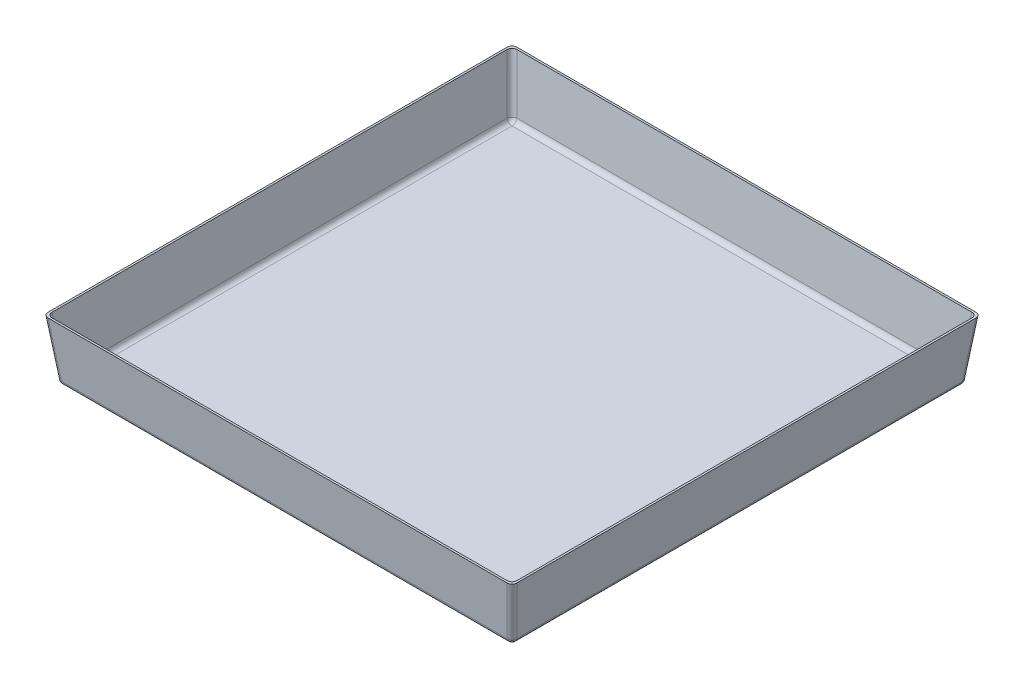
ISO-10303-21;
HEADER;
FILE_DESCRIPTION(('STEP AP214'),'2;1');
FILE_NAME('part.step','',(''),(''),'','','');
FILE_SCHEMA(('AUTOMOTIVE_DESIGN { 1 0 10303 214 1 1 1 1 }'));
ENDSEC;
DATA;
#1=APPLICATION_CONTEXT('core data for automotive mechanical design processes');
#2=APPLICATION_PROTOCOL_DEFINITION('international standard','automotive_design',2000,#1);
#3=PRODUCT_CONTEXT('',#1,'mechanical');
#4=PRODUCT('Part','Part','',(#3));
#5=PRODUCT_RELATED_PRODUCT_CATEGORY('part','',(#4));
#6=PRODUCT_DEFINITION_FORMATION('','',#4);
#7=PRODUCT_DEFINITION_CONTEXT('part definition',#1,'design');
#8=PRODUCT_DEFINITION('design','',#6,#7);
#9=PRODUCT_DEFINITION_SHAPE('','',#8);
#10=(LENGTH_UNIT() NAMED_UNIT(*) SI_UNIT(.MILLI.,.METRE.));
#11=(NAMED_UNIT(*) PLANE_ANGLE_UNIT() SI_UNIT($,.RADIAN.));
#12=(NAMED_UNIT(*) SI_UNIT($,.STERADIAN.) SOLID_ANGLE_UNIT());
#13=UNCERTAINTY_MEASURE_WITH_UNIT(LENGTH_MEASURE(1.E-05),#10,'distance_accuracy_value','');
#14=(GEOMETRIC_REPRESENTATION_CONTEXT(3) GLOBAL_UNCERTAINTY_ASSIGNED_CONTEXT((#13)) GLOBAL_UNIT_ASSIGNED_CONTEXT((#10,
#11,#12)) REPRESENTATION_CONTEXT('',''));
#15=CARTESIAN_POINT('',(0.,0.,0.));
#16=DIRECTION('',(0.,0.,1.));
#17=DIRECTION('',(1.,0.,0.));
#18=AXIS2_PLACEMENT_3D('',#15,#16,#17);
#19=CARTESIAN_POINT('',(-460.,0.,460.));
#20=DIRECTION('',(-0.992546151641322,-0.121869343405148,0.));
#21=DIRECTION('',(0.121869343405148,-0.992546151641322,0.));
#22=AXIS2_PLACEMENT_3D('',#19,#20,#21);
#23=PLANE('',#22);
#24=DIRECTION('',(-0.120974291151355,0.985256536015293,-0.120974291151355));
#25=VECTOR('',#24,1.);
#26=CARTESIAN_POINT('',(-446.681260146946,-108.472431347346,-436.755798630532));
#27=LINE('',#26,#25);
#28=CARTESIAN_POINT('',(-474.734147308349,120.,-464.808685791935));
#29=VERTEX_POINT('',#28);
#30=CARTESIAN_POINT('',(-461.078208870854,8.78130656594857,-451.152747354441));
#31=VERTEX_POINT('',#30);
#32=EDGE_CURVE('E331',#29,#31,#27,.F.);
#33=ORIENTED_EDGE('',*,*,#32,.T.);
#34=DIRECTION('',(0.,0.,1.));
#35=VECTOR('',#34,1.);
#36=CARTESIAN_POINT('',(-461.078208870854,8.78130656594853,460.));
#37=LINE('',#36,#35);
#38=CARTESIAN_POINT('',(-461.078208870854,8.78130656594853,451.152747354441));
#39=VERTEX_POINT('',#38);
#40=EDGE_CURVE('E240',#31,#39,#37,.T.);
#41=ORIENTED_EDGE('',*,*,#40,.T.);
#42=DIRECTION('',(-0.120974291151355,0.985256536015293,0.120974291151355));
#43=VECTOR('',#42,1.);
#44=CARTESIAN_POINT('',(-460.145256936953,1.18302281560784,450.219795420539));
#45=LINE('',#44,#43);
#46=CARTESIAN_POINT('',(-474.734147308349,120.,464.808685791935));
#47=VERTEX_POINT('',#46);
#48=EDGE_CURVE('E326',#39,#47,#45,.T.);
#49=ORIENTED_EDGE('',*,*,#48,.T.);
#50=DIRECTION('',(0.,0.,-1.));
#51=VECTOR('',#50,1.);
#52=CARTESIAN_POINT('',(-474.734147308349,120.,460.));
#53=LINE('',#52,#51);
#54=EDGE_CURVE('E200',#29,#47,#53,.F.);
#55=ORIENTED_EDGE('',*,*,#54,.F.);
#56=EDGE_LOOP('',(#33,#41,#49,#55));
#57=FACE_BOUND('',#56,.T.);
#58=ADVANCED_FACE('F40',(#57),#23,.T.);
#59=CARTESIAN_POINT('',(460.,0.,460.));
#60=DIRECTION('',(0.,-0.121869343405148,0.992546151641322));
#61=DIRECTION('',(0.,-0.992546151641322,-0.121869343405148));
#62=AXIS2_PLACEMENT_3D('',#59,#60,#61);
#63=PLANE('',#62);
#64=DIRECTION('',(-0.120974291151355,0.985256536015293,0.120974291151355));
#65=VECTOR('',#64,1.);
#66=CARTESIAN_POINT('',(-436.755798630533,-108.472431347346,446.681260146946));
#67=LINE('',#66,#65);
#68=CARTESIAN_POINT('',(-464.808685791935,120.,474.734147308349));
#69=VERTEX_POINT('',#68);
#70=CARTESIAN_POINT('',(-451.152747354441,8.78130656594855,461.078208870854));
#71=VERTEX_POINT('',#70);
#72=EDGE_CURVE('E359',#69,#71,#67,.F.);
#73=ORIENTED_EDGE('',*,*,#72,.T.);
#74=DIRECTION('',(1.,0.,0.));
#75=VECTOR('',#74,1.);
#76=CARTESIAN_POINT('',(460.,8.78130656594853,461.078208870854));
#77=LINE('',#76,#75);
#78=CARTESIAN_POINT('',(451.152747354441,8.78130656594852,461.078208870854));
#79=VERTEX_POINT('',#78);
#80=EDGE_CURVE('E219',#71,#79,#77,.T.);
#81=ORIENTED_EDGE('',*,*,#80,.T.);
#82=DIRECTION('',(0.120974291151355,0.985256536015293,0.120974291151355));
#83=VECTOR('',#82,1.);
#84=CARTESIAN_POINT('',(450.219795420539,1.18302281560784,460.145256936953));
#85=LINE('',#84,#83);
#86=CARTESIAN_POINT('',(464.808685791935,120.,474.734147308349));
#87=VERTEX_POINT('',#86);
#88=EDGE_CURVE('E211',#79,#87,#85,.T.);
#89=ORIENTED_EDGE('',*,*,#88,.T.);
#90=DIRECTION('',(-1.,0.,0.));
#91=VECTOR('',#90,1.);
#92=CARTESIAN_POINT('',(460.,120.,474.734147308349));
#93=LINE('',#92,#91);
#94=EDGE_CURVE('E366',#69,#87,#93,.F.);
#95=ORIENTED_EDGE('',*,*,#94,.F.);
#96=EDGE_LOOP('',(#73,#81,#89,#95));
#97=FACE_BOUND('',#96,.T.);
#98=ADVANCED_FACE('F365',(#97),#63,.T.);
#99=CARTESIAN_POINT('',(460.,0.,460.));
#100=DIRECTION('',(0.992546151641322,-0.121869343405148,0.));
#101=DIRECTION('',(0.121869343405148,0.992546151641322,0.));
#102=AXIS2_PLACEMENT_3D('',#99,#100,#101);
#103=PLANE('',#102);
#104=DIRECTION('',(0.120974291151355,0.985256536015293,0.120974291151355));
#105=VECTOR('',#104,1.);
#106=CARTESIAN_POINT('',(460.145256936953,1.18302281560784,450.219795420539));
#107=LINE('',#106,#105);
#108=CARTESIAN_POINT('',(474.734147308349,120.,464.808685791935));
#109=VERTEX_POINT('',#108);
#110=CARTESIAN_POINT('',(461.078208870854,8.78130656594853,451.152747354441));
#111=VERTEX_POINT('',#110);
#112=EDGE_CURVE('E350',#109,#111,#107,.F.);
#113=ORIENTED_EDGE('',*,*,#112,.T.);
#114=DIRECTION('',(0.,0.,-1.));
#115=VECTOR('',#114,1.);
#116=CARTESIAN_POINT('',(461.078208870854,8.78130656594853,460.));
#117=LINE('',#116,#115);
#118=CARTESIAN_POINT('',(461.078208870854,8.78130656594855,-451.152747354441));
#119=VERTEX_POINT('',#118);
#120=EDGE_CURVE('E232',#111,#119,#117,.T.);
#121=ORIENTED_EDGE('',*,*,#120,.T.);
#122=DIRECTION('',(0.120974291151355,0.985256536015293,-0.120974291151355));
#123=VECTOR('',#122,1.);
#124=CARTESIAN_POINT('',(446.681260146946,-108.472431347346,-436.755798630533));
#125=LINE('',#124,#123);
#126=CARTESIAN_POINT('',(474.734147308349,120.,-464.808685791935));
#127=VERTEX_POINT('',#126);
#128=EDGE_CURVE('E353',#119,#127,#125,.T.);
#129=ORIENTED_EDGE('',*,*,#128,.T.);
#130=DIRECTION('',(0.,0.,1.));
#131=VECTOR('',#130,1.);
#132=CARTESIAN_POINT('',(474.734147308349,120.,460.));
#133=LINE('',#132,#131);
#134=EDGE_CURVE('E377',#109,#127,#133,.F.);
#135=ORIENTED_EDGE('',*,*,#134,.F.);
#136=EDGE_LOOP('',(#113,#121,#129,#135));
#137=FACE_BOUND('',#136,.T.);
#138=ADVANCED_FACE('F383',(#137),#103,.T.);
#139=CARTESIAN_POINT('',(460.,0.,-460.));
#140=DIRECTION('',(0.,-0.121869343405148,-0.992546151641322));
#141=DIRECTION('',(0.,0.992546151641322,-0.121869343405148));
#142=AXIS2_PLACEMENT_3D('',#139,#140,#141);
#143=PLANE('',#142);
#144=DIRECTION('',(0.120974291151355,0.985256536015293,-0.120974291151355));
#145=VECTOR('',#144,1.);
#146=CARTESIAN_POINT('',(450.219795420539,1.18302281560784,-460.145256936953));
#147=LINE('',#146,#145);
#148=CARTESIAN_POINT('',(464.808685791935,120.,-474.734147308349));
#149=VERTEX_POINT('',#148);
#150=CARTESIAN_POINT('',(451.152747354441,8.78130656594853,-461.078208870854));
#151=VERTEX_POINT('',#150);
#152=EDGE_CURVE('E334',#149,#151,#147,.F.);
#153=ORIENTED_EDGE('',*,*,#152,.T.);
#154=DIRECTION('',(-1.,0.,0.));
#155=VECTOR('',#154,1.);
#156=CARTESIAN_POINT('',(460.,8.78130656594853,-461.078208870854));
#157=LINE('',#156,#155);
#158=CARTESIAN_POINT('',(-451.152747354441,8.78130656594854,-461.078208870854));
#159=VERTEX_POINT('',#158);
#160=EDGE_CURVE('E236',#151,#159,#157,.T.);
#161=ORIENTED_EDGE('',*,*,#160,.T.);
#162=DIRECTION('',(-0.120974291151355,0.985256536015293,-0.120974291151355));
#163=VECTOR('',#162,1.);
#164=CARTESIAN_POINT('',(-436.755798630533,-108.472431347346,-446.681260146945));
#165=LINE('',#164,#163);
#166=CARTESIAN_POINT('',(-464.808685791935,120.,-474.734147308348));
#167=VERTEX_POINT('',#166);
#168=EDGE_CURVE('E337',#159,#167,#165,.T.);
#169=ORIENTED_EDGE('',*,*,#168,.T.);
#170=DIRECTION('',(1.,0.,0.));
#171=VECTOR('',#170,1.);
#172=CARTESIAN_POINT('',(460.,120.,-474.734147308349));
#173=LINE('',#172,#171);
#174=EDGE_CURVE('E189',#149,#167,#173,.F.);
#175=ORIENTED_EDGE('',*,*,#174,.F.);
#176=EDGE_LOOP('',(#153,#161,#169,#175));
#177=FACE_BOUND('',#176,.T.);
#178=ADVANCED_FACE('F415',(#177),#143,.T.);
#179=CARTESIAN_POINT('',(-460.,120.,-460.));
#180=DIRECTION('',(0.,1.,0.));
#181=DIRECTION('',(0.,0.,1.));
#182=AXIS2_PLACEMENT_3D('',#179,#180,#181);
#183=PLANE('',#182);
#184=DIRECTION('',(0.,0.,-1.));
#185=VECTOR('',#184,1.);
#186=CARTESIAN_POINT('',(-470.704108006513,120.,460.));
#187=LINE('',#186,#185);
#188=CARTESIAN_POINT('',(-470.704108006513,120.,-460.7786464901));
#189=VERTEX_POINT('',#188);
#190=CARTESIAN_POINT('',(-470.704108006513,120.,460.7786464901));
#191=VERTEX_POINT('',#190);
#192=EDGE_CURVE('E285',#189,#191,#187,.F.);
#193=ORIENTED_EDGE('',*,*,#192,.F.);
#194=CARTESIAN_POINT('',(-460.629009751925,120.,-460.629009751925));
#195=DIRECTION('',(0.,1.,0.));
#196=DIRECTION('',(-0.707106781186548,0.,-0.707106781186548));
#197=AXIS2_PLACEMENT_3D('',#194,#195,#196);
#198=ELLIPSE('',#197,10.1496408645441,10.);
#199=CARTESIAN_POINT('',(-460.7786464901,120.,-470.704108006513));
#200=VERTEX_POINT('',#199);
#201=EDGE_CURVE('E199',#189,#200,#198,.F.);
#202=ORIENTED_EDGE('',*,*,#201,.T.);
#203=DIRECTION('',(1.,0.,0.));
#204=VECTOR('',#203,1.);
#205=CARTESIAN_POINT('',(460.,120.,-470.704108006513));
#206=LINE('',#205,#204);
#207=CARTESIAN_POINT('',(460.7786464901,120.,-470.704108006513));
#208=VERTEX_POINT('',#207);
#209=EDGE_CURVE('E182',#208,#200,#206,.F.);
#210=ORIENTED_EDGE('',*,*,#209,.F.);
#211=CARTESIAN_POINT('',(460.629009751925,120.,-460.629009751925));
#212=DIRECTION('',(0.,1.,0.));
#213=DIRECTION('',(0.707106781186547,0.,-0.707106781186548));
#214=AXIS2_PLACEMENT_3D('',#211,#212,#213);
#215=ELLIPSE('',#214,10.1496408645441,10.);
#216=CARTESIAN_POINT('',(470.704108006513,120.,-460.7786464901));
#217=VERTEX_POINT('',#216);
#218=EDGE_CURVE('E196',#208,#217,#215,.F.);
#219=ORIENTED_EDGE('',*,*,#218,.T.);
#220=DIRECTION('',(0.,0.,1.));
#221=VECTOR('',#220,1.);
#222=CARTESIAN_POINT('',(470.704108006513,120.,460.));
#223=LINE('',#222,#221);
#224=CARTESIAN_POINT('',(470.704108006513,120.,460.7786464901));
#225=VERTEX_POINT('',#224);
#226=EDGE_CURVE('E201',#225,#217,#223,.F.);
#227=ORIENTED_EDGE('',*,*,#226,.F.);
#228=CARTESIAN_POINT('',(460.629009751925,120.,460.629009751925));
#229=DIRECTION('',(0.,1.,0.));
#230=DIRECTION('',(0.707106781186548,0.,0.707106781186548));
#231=AXIS2_PLACEMENT_3D('',#228,#229,#230);
#232=ELLIPSE('',#231,10.1496408645441,10.);
#233=CARTESIAN_POINT('',(460.7786464901,120.,470.704108006513));
#234=VERTEX_POINT('',#233);
#235=EDGE_CURVE('E207',#225,#234,#232,.F.);
#236=ORIENTED_EDGE('',*,*,#235,.T.);
#237=DIRECTION('',(-1.,0.,0.));
#238=VECTOR('',#237,1.);
#239=CARTESIAN_POINT('',(460.,120.,470.704108006513));
#240=LINE('',#239,#238);
#241=CARTESIAN_POINT('',(-460.7786464901,120.,470.704108006513));
#242=VERTEX_POINT('',#241);
#243=EDGE_CURVE('E423',#242,#234,#240,.F.);
#244=ORIENTED_EDGE('',*,*,#243,.F.);
#245=CARTESIAN_POINT('',(-460.629009751925,120.,460.629009751925));
#246=DIRECTION('',(0.,1.,0.));
#247=DIRECTION('',(-0.707106781186547,0.,0.707106781186548));
#248=AXIS2_PLACEMENT_3D('',#245,#246,#247);
#249=ELLIPSE('',#248,10.1496408645441,10.);
#250=EDGE_CURVE('E209',#242,#191,#249,.F.);
#251=ORIENTED_EDGE('',*,*,#250,.T.);
#252=EDGE_LOOP('',(#193,#202,#210,#219,#227,#236,#244,#251));
#253=FACE_BOUND('',#252,.T.);
#254=ORIENTED_EDGE('',*,*,#174,.T.);
#255=CARTESIAN_POINT('',(-464.65904905376,120.,-464.65904905376));
#256=DIRECTION('',(0.,1.,0.));
#257=DIRECTION('',(0.707106781186548,0.,0.707106781186548));
#258=AXIS2_PLACEMENT_3D('',#255,#256,#257);
#259=ELLIPSE('',#258,10.1496408645441,10.);
#260=EDGE_CURVE('E345',#167,#29,#259,.T.);
#261=ORIENTED_EDGE('',*,*,#260,.T.);
#262=ORIENTED_EDGE('',*,*,#54,.T.);
#263=CARTESIAN_POINT('',(-464.65904905376,120.,464.65904905376));
#264=DIRECTION('',(0.,1.,0.));
#265=DIRECTION('',(0.707106781186547,0.,-0.707106781186548));
#266=AXIS2_PLACEMENT_3D('',#263,#264,#265);
#267=ELLIPSE('',#266,10.1496408645441,10.);
#268=EDGE_CURVE('E339',#47,#69,#267,.T.);
#269=ORIENTED_EDGE('',*,*,#268,.T.);
#270=ORIENTED_EDGE('',*,*,#94,.T.);
#271=CARTESIAN_POINT('',(464.65904905376,120.,464.65904905376));
#272=DIRECTION('',(0.,1.,0.));
#273=DIRECTION('',(-0.707106781186548,0.,-0.707106781186548));
#274=AXIS2_PLACEMENT_3D('',#271,#272,#273);
#275=ELLIPSE('',#274,10.1496408645441,10.);
#276=EDGE_CURVE('E341',#87,#109,#275,.T.);
#277=ORIENTED_EDGE('',*,*,#276,.T.);
#278=ORIENTED_EDGE('',*,*,#134,.T.);
#279=CARTESIAN_POINT('',(464.65904905376,120.,-464.65904905376));
#280=DIRECTION('',(0.,1.,0.));
#281=DIRECTION('',(-0.707106781186547,0.,0.707106781186548));
#282=AXIS2_PLACEMENT_3D('',#279,#280,#281);
#283=ELLIPSE('',#282,10.1496408645441,10.);
#284=EDGE_CURVE('E343',#127,#149,#283,.T.);
#285=ORIENTED_EDGE('',*,*,#284,.T.);
#286=EDGE_LOOP('',(#254,#261,#262,#269,#270,#277,#278,#285));
#287=FACE_BOUND('',#286,.T.);
#288=ADVANCED_FACE('F193',(#253,#287),#183,.T.);
#289=CARTESIAN_POINT('',(-460.,0.,-460.));
#290=DIRECTION('',(0.,1.,0.));
#291=DIRECTION('',(0.,0.,1.));
#292=AXIS2_PLACEMENT_3D('',#289,#290,#291);
#293=PLANE('',#292);
#294=DIRECTION('',(0.,0.,1.));
#295=VECTOR('',#294,1.);
#296=CARTESIAN_POINT('',(451.152747354441,0.,-460.));
#297=LINE('',#296,#295);
#298=CARTESIAN_POINT('',(451.152747354441,0.,-451.152747354441));
#299=VERTEX_POINT('',#298);
#300=CARTESIAN_POINT('',(451.152747354441,0.,451.152747354441));
#301=VERTEX_POINT('',#300);
#302=EDGE_CURVE('E225',#299,#301,#297,.T.);
#303=ORIENTED_EDGE('',*,*,#302,.T.);
#304=DIRECTION('',(-1.,0.,0.));
#305=VECTOR('',#304,1.);
#306=CARTESIAN_POINT('',(-460.,0.,451.152747354441));
#307=LINE('',#306,#305);
#308=CARTESIAN_POINT('',(-451.152747354441,0.,451.152747354441));
#309=VERTEX_POINT('',#308);
#310=EDGE_CURVE('E227',#301,#309,#307,.T.);
#311=ORIENTED_EDGE('',*,*,#310,.T.);
#312=DIRECTION('',(0.,0.,-1.));
#313=VECTOR('',#312,1.);
#314=CARTESIAN_POINT('',(-451.152747354441,0.,-460.));
#315=LINE('',#314,#313);
#316=CARTESIAN_POINT('',(-451.152747354441,0.,-451.152747354441));
#317=VERTEX_POINT('',#316);
#318=EDGE_CURVE('E221',#309,#317,#315,.T.);
#319=ORIENTED_EDGE('',*,*,#318,.T.);
#320=DIRECTION('',(1.,0.,0.));
#321=VECTOR('',#320,1.);
#322=CARTESIAN_POINT('',(-460.,0.,-451.152747354441));
#323=LINE('',#322,#321);
#324=EDGE_CURVE('E223',#317,#299,#323,.T.);
#325=ORIENTED_EDGE('',*,*,#324,.T.);
#326=EDGE_LOOP('',(#303,#311,#319,#325));
#327=FACE_BOUND('',#326,.T.);
#328=ADVANCED_FACE('F399',(#327),#293,.F.);
#329=CARTESIAN_POINT('',(-456.029815393435,0.487477373620591,460.));
#330=DIRECTION('',(-0.992546151641322,-0.121869343405148,0.));
#331=DIRECTION('',(0.121869343405148,-0.992546151641322,0.));
#332=AXIS2_PLACEMENT_3D('',#329,#330,#331);
#333=PLANE('',#332);
#334=DIRECTION('',(-0.120974291151355,0.985256536015293,0.120974291151355));
#335=VECTOR('',#334,1.);
#336=CARTESIAN_POINT('',(-456.606355878729,5.18302281560784,446.680894362316));
#337=LINE('',#336,#335);
#338=CARTESIAN_POINT('',(-457.53930781263,12.7813065659485,447.613846296217));
#339=VERTEX_POINT('',#338);
#340=EDGE_CURVE('E320',#191,#339,#337,.F.);
#341=ORIENTED_EDGE('',*,*,#340,.T.);
#342=DIRECTION('',(0.,0.,1.));
#343=VECTOR('',#342,1.);
#344=CARTESIAN_POINT('',(-457.53930781263,12.7813065659485,-446.535637425363));
#345=LINE('',#344,#343);
#346=CARTESIAN_POINT('',(-457.53930781263,12.7813065659485,-447.613846296217));
#347=VERTEX_POINT('',#346);
#348=EDGE_CURVE('E64',#339,#347,#345,.F.);
#349=ORIENTED_EDGE('',*,*,#348,.T.);
#350=DIRECTION('',(-0.120974291151355,0.985256536015293,-0.120974291151355));
#351=VECTOR('',#350,1.);
#352=CARTESIAN_POINT('',(-470.849364943466,121.183022815608,-460.923903427052));
#353=LINE('',#352,#351);
#354=EDGE_CURVE('E324',#347,#189,#353,.T.);
#355=ORIENTED_EDGE('',*,*,#354,.T.);
#356=ORIENTED_EDGE('',*,*,#192,.T.);
#357=EDGE_LOOP('',(#341,#349,#355,#356));
#358=FACE_BOUND('',#357,.T.);
#359=ADVANCED_FACE('F323',(#358),#333,.F.);
#360=CARTESIAN_POINT('',(460.,0.487477373620591,456.029815393435));
#361=DIRECTION('',(0.,-0.121869343405148,0.992546151641322));
#362=DIRECTION('',(0.,-0.992546151641322,-0.121869343405148));
#363=AXIS2_PLACEMENT_3D('',#360,#361,#362);
#364=PLANE('',#363);
#365=DIRECTION('',(0.120974291151355,0.985256536015293,0.120974291151355));
#366=VECTOR('',#365,1.);
#367=CARTESIAN_POINT('',(446.680894362316,5.18302281560784,456.606355878729));
#368=LINE('',#367,#366);
#369=CARTESIAN_POINT('',(447.613846296217,12.7813065659485,457.53930781263));
#370=VERTEX_POINT('',#369);
#371=EDGE_CURVE('E356',#234,#370,#368,.F.);
#372=ORIENTED_EDGE('',*,*,#371,.T.);
#373=DIRECTION('',(1.,0.,0.));
#374=VECTOR('',#373,1.);
#375=CARTESIAN_POINT('',(-446.535637425363,12.7813065659485,457.53930781263));
#376=LINE('',#375,#374);
#377=CARTESIAN_POINT('',(-447.613846296217,12.7813065659485,457.53930781263));
#378=VERTEX_POINT('',#377);
#379=EDGE_CURVE('E257',#370,#378,#376,.F.);
#380=ORIENTED_EDGE('',*,*,#379,.T.);
#381=DIRECTION('',(-0.120974291151355,0.985256536015293,0.120974291151355));
#382=VECTOR('',#381,1.);
#383=CARTESIAN_POINT('',(-460.923903427053,121.183022815608,470.849364943466));
#384=LINE('',#383,#382);
#385=EDGE_CURVE('E321',#378,#242,#384,.T.);
#386=ORIENTED_EDGE('',*,*,#385,.T.);
#387=ORIENTED_EDGE('',*,*,#243,.T.);
#388=EDGE_LOOP('',(#372,#380,#386,#387));
#389=FACE_BOUND('',#388,.T.);
#390=ADVANCED_FACE('F429',(#389),#364,.F.);
#391=CARTESIAN_POINT('',(456.029815393435,0.487477373620591,460.));
#392=DIRECTION('',(0.992546151641322,-0.121869343405148,0.));
#393=DIRECTION('',(0.121869343405148,0.992546151641322,0.));
#394=AXIS2_PLACEMENT_3D('',#391,#392,#393);
#395=PLANE('',#394);
#396=DIRECTION('',(0.120974291151355,0.985256536015293,-0.120974291151355));
#397=VECTOR('',#396,1.);
#398=CARTESIAN_POINT('',(456.606355878729,5.18302281560787,-446.680894362315));
#399=LINE('',#398,#397);
#400=CARTESIAN_POINT('',(457.53930781263,12.7813065659485,-447.613846296217));
#401=VERTEX_POINT('',#400);
#402=EDGE_CURVE('E206',#217,#401,#399,.F.);
#403=ORIENTED_EDGE('',*,*,#402,.T.);
#404=DIRECTION('',(0.,0.,-1.));
#405=VECTOR('',#404,1.);
#406=CARTESIAN_POINT('',(457.53930781263,12.7813065659485,446.535637425363));
#407=LINE('',#406,#405);
#408=CARTESIAN_POINT('',(457.53930781263,12.7813065659485,447.613846296217));
#409=VERTEX_POINT('',#408);
#410=EDGE_CURVE('E253',#401,#409,#407,.F.);
#411=ORIENTED_EDGE('',*,*,#410,.T.);
#412=DIRECTION('',(0.120974291151355,0.985256536015293,0.120974291151355));
#413=VECTOR('',#412,1.);
#414=CARTESIAN_POINT('',(470.849364943466,121.183022815608,460.923903427053));
#415=LINE('',#414,#413);
#416=EDGE_CURVE('E347',#409,#225,#415,.T.);
#417=ORIENTED_EDGE('',*,*,#416,.T.);
#418=ORIENTED_EDGE('',*,*,#226,.T.);
#419=EDGE_LOOP('',(#403,#411,#417,#418));
#420=FACE_BOUND('',#419,.T.);
#421=ADVANCED_FACE('F457',(#420),#395,.F.);
#422=CARTESIAN_POINT('',(460.,0.487477373620591,-456.029815393435));
#423=DIRECTION('',(0.,-0.121869343405148,-0.992546151641322));
#424=DIRECTION('',(0.,0.992546151641322,-0.121869343405148));
#425=AXIS2_PLACEMENT_3D('',#422,#423,#424);
#426=PLANE('',#425);
#427=DIRECTION('',(-0.120974291151355,0.985256536015293,-0.120974291151355));
#428=VECTOR('',#427,1.);
#429=CARTESIAN_POINT('',(-446.680894362315,5.18302281560787,-456.606355878729));
#430=LINE('',#429,#428);
#431=CARTESIAN_POINT('',(-447.613846296217,12.7813065659485,-457.53930781263));
#432=VERTEX_POINT('',#431);
#433=EDGE_CURVE('E188',#200,#432,#430,.F.);
#434=ORIENTED_EDGE('',*,*,#433,.T.);
#435=DIRECTION('',(-1.,0.,0.));
#436=VECTOR('',#435,1.);
#437=CARTESIAN_POINT('',(446.535637425363,12.7813065659485,-457.53930781263));
#438=LINE('',#437,#436);
#439=CARTESIAN_POINT('',(447.613846296217,12.7813065659485,-457.53930781263));
#440=VERTEX_POINT('',#439);
#441=EDGE_CURVE('E12',#432,#440,#438,.F.);
#442=ORIENTED_EDGE('',*,*,#441,.T.);
#443=DIRECTION('',(0.120974291151355,0.985256536015293,-0.120974291151355));
#444=VECTOR('',#443,1.);
#445=CARTESIAN_POINT('',(460.923903427053,121.183022815608,-470.849364943466));
#446=LINE('',#445,#444);
#447=EDGE_CURVE('E179',#440,#208,#446,.T.);
#448=ORIENTED_EDGE('',*,*,#447,.T.);
#449=ORIENTED_EDGE('',*,*,#209,.T.);
#450=EDGE_LOOP('',(#434,#442,#448,#449));
#451=FACE_BOUND('',#450,.T.);
#452=ADVANCED_FACE('F181',(#451),#426,.F.);
#453=CARTESIAN_POINT('',(-460.,4.,-460.));
#454=DIRECTION('',(0.,1.,0.));
#455=DIRECTION('',(0.,0.,1.));
#456=AXIS2_PLACEMENT_3D('',#453,#454,#455);
#457=PLANE('',#456);
#458=DIRECTION('',(-1.,0.,0.));
#459=VECTOR('',#458,1.);
#460=CARTESIAN_POINT('',(446.535637425363,4.,447.613846296217));
#461=LINE('',#460,#459);
#462=CARTESIAN_POINT('',(-447.613846296217,4.,447.613846296217));
#463=VERTEX_POINT('',#462);
#464=CARTESIAN_POINT('',(447.613846296217,4.,447.613846296217));
#465=VERTEX_POINT('',#464);
#466=EDGE_CURVE('E248',#463,#465,#461,.F.);
#467=ORIENTED_EDGE('',*,*,#466,.T.);
#468=DIRECTION('',(0.,0.,1.));
#469=VECTOR('',#468,1.);
#470=CARTESIAN_POINT('',(447.613846296217,4.,-446.535637425363));
#471=LINE('',#470,#469);
#472=CARTESIAN_POINT('',(447.613846296217,4.,-447.613846296217));
#473=VERTEX_POINT('',#472);
#474=EDGE_CURVE('E250',#465,#473,#471,.F.);
#475=ORIENTED_EDGE('',*,*,#474,.T.);
#476=DIRECTION('',(1.,0.,0.));
#477=VECTOR('',#476,1.);
#478=CARTESIAN_POINT('',(-446.535637425363,4.,-447.613846296217));
#479=LINE('',#478,#477);
#480=CARTESIAN_POINT('',(-447.613846296217,4.,-447.613846296217));
#481=VERTEX_POINT('',#480);
#482=EDGE_CURVE('E244',#473,#481,#479,.F.);
#483=ORIENTED_EDGE('',*,*,#482,.T.);
#484=DIRECTION('',(0.,0.,-1.));
#485=VECTOR('',#484,1.);
#486=CARTESIAN_POINT('',(-447.613846296217,4.,446.535637425363));
#487=LINE('',#486,#485);
#488=EDGE_CURVE('E246',#481,#463,#487,.F.);
#489=ORIENTED_EDGE('',*,*,#488,.T.);
#490=EDGE_LOOP('',(#467,#475,#483,#489));
#491=FACE_BOUND('',#490,.T.);
#492=ADVANCED_FACE('F445',(#491),#457,.T.);
#493=CARTESIAN_POINT('',(-432.843716798748,-106.293051413431,-432.843716798748));
#494=DIRECTION('',(-0.120974291151355,0.985256536015293,-0.120974291151355));
#495=DIRECTION('',(-0.992546151641322,-0.121869343405148,0.));
#496=AXIS2_PLACEMENT_3D('',#493,#494,#495);
#497=CYLINDRICAL_SURFACE('',#496,10.);
#498=ORIENTED_EDGE('',*,*,#354,.F.);
#499=CARTESIAN_POINT('',(-447.613846296217,14.,-447.613846296217));
#500=DIRECTION('',(-0.120974291151355,0.985256536015293,-0.120974291151355));
#501=DIRECTION('',(-0.992546151641322,-0.121869343405148,0.));
#502=AXIS2_PLACEMENT_3D('',#499,#500,#501);
#503=CIRCLE('',#502,10.);
#504=EDGE_CURVE('E49',#347,#432,#503,.F.);
#505=ORIENTED_EDGE('',*,*,#504,.T.);
#506=ORIENTED_EDGE('',*,*,#433,.F.);
#507=ORIENTED_EDGE('',*,*,#201,.F.);
#508=EDGE_LOOP('',(#498,#505,#506,#507));
#509=FACE_BOUND('',#508,.T.);
#510=ADVANCED_FACE('F480',(#509),#497,.F.);
#511=CARTESIAN_POINT('',(-436.755798630532,-107.253737913295,-436.755798630532));
#512=DIRECTION('',(0.120974291151355,-0.985256536015293,0.120974291151355));
#513=DIRECTION('',(0.992546151641322,0.121869343405148,0.));
#514=AXIS2_PLACEMENT_3D('',#511,#512,#513);
#515=CYLINDRICAL_SURFACE('',#514,10.);
#516=ORIENTED_EDGE('',*,*,#168,.F.);
#517=CARTESIAN_POINT('',(-451.152747354441,10.,-451.152747354441));
#518=DIRECTION('',(0.120974291151355,-0.985256536015293,0.120974291151355));
#519=DIRECTION('',(0.992546151641322,0.121869343405148,0.));
#520=AXIS2_PLACEMENT_3D('',#517,#518,#519);
#521=CIRCLE('',#520,10.);
#522=EDGE_CURVE('E238',#159,#31,#521,.F.);
#523=ORIENTED_EDGE('',*,*,#522,.T.);
#524=ORIENTED_EDGE('',*,*,#32,.F.);
#525=ORIENTED_EDGE('',*,*,#260,.F.);
#526=EDGE_LOOP('',(#516,#523,#524,#525));
#527=FACE_BOUND('',#526,.T.);
#528=ADVANCED_FACE('F483',(#527),#515,.T.);
#529=CARTESIAN_POINT('',(432.843716798748,-106.293051413431,-432.843716798748));
#530=DIRECTION('',(0.120974291151355,0.985256536015293,-0.120974291151355));
#531=DIRECTION('',(0.,0.121869343405148,0.992546151641322));
#532=AXIS2_PLACEMENT_3D('',#529,#530,#531);
#533=CYLINDRICAL_SURFACE('',#532,10.);
#534=ORIENTED_EDGE('',*,*,#447,.F.);
#535=CARTESIAN_POINT('',(447.613846296217,14.,-447.613846296217));
#536=DIRECTION('',(0.120974291151355,0.985256536015293,-0.120974291151355));
#537=DIRECTION('',(0.,0.121869343405148,0.992546151641322));
#538=AXIS2_PLACEMENT_3D('',#535,#536,#537);
#539=CIRCLE('',#538,10.);
#540=EDGE_CURVE('E242',#440,#401,#539,.F.);
#541=ORIENTED_EDGE('',*,*,#540,.T.);
#542=ORIENTED_EDGE('',*,*,#402,.F.);
#543=ORIENTED_EDGE('',*,*,#218,.F.);
#544=EDGE_LOOP('',(#534,#541,#542,#543));
#545=FACE_BOUND('',#544,.T.);
#546=ADVANCED_FACE('F204',(#545),#533,.F.);
#547=CARTESIAN_POINT('',(450.219795420539,2.40171624965932,-450.219795420539));
#548=DIRECTION('',(-0.120974291151355,-0.985256536015293,0.120974291151355));
#549=DIRECTION('',(0.,-0.121869343405148,-0.992546151641322));
#550=AXIS2_PLACEMENT_3D('',#547,#548,#549);
#551=CYLINDRICAL_SURFACE('',#550,10.);
#552=ORIENTED_EDGE('',*,*,#128,.F.);
#553=CARTESIAN_POINT('',(451.152747354441,10.,-451.152747354441));
#554=DIRECTION('',(-0.120974291151355,-0.985256536015293,0.120974291151355));
#555=DIRECTION('',(0.,-0.121869343405148,-0.992546151641322));
#556=AXIS2_PLACEMENT_3D('',#553,#554,#555);
#557=CIRCLE('',#556,10.);
#558=EDGE_CURVE('E234',#119,#151,#557,.F.);
#559=ORIENTED_EDGE('',*,*,#558,.T.);
#560=ORIENTED_EDGE('',*,*,#152,.F.);
#561=ORIENTED_EDGE('',*,*,#284,.F.);
#562=EDGE_LOOP('',(#552,#559,#560,#561));
#563=FACE_BOUND('',#562,.T.);
#564=ADVANCED_FACE('F411',(#563),#551,.T.);
#565=CARTESIAN_POINT('',(446.307713588755,3.36240274952305,446.307713588755));
#566=DIRECTION('',(0.120974291151355,0.985256536015293,0.120974291151355));
#567=DIRECTION('',(-0.992546151641322,0.121869343405148,0.));
#568=AXIS2_PLACEMENT_3D('',#565,#566,#567);
#569=CYLINDRICAL_SURFACE('',#568,10.);
#570=ORIENTED_EDGE('',*,*,#416,.F.);
#571=CARTESIAN_POINT('',(447.613846296217,14.,447.613846296217));
#572=DIRECTION('',(0.120974291151355,0.985256536015293,0.120974291151355));
#573=DIRECTION('',(-0.992546151641322,0.121869343405148,0.));
#574=AXIS2_PLACEMENT_3D('',#571,#572,#573);
#575=CIRCLE('',#574,10.);
#576=EDGE_CURVE('E255',#409,#370,#575,.F.);
#577=ORIENTED_EDGE('',*,*,#576,.T.);
#578=ORIENTED_EDGE('',*,*,#371,.F.);
#579=ORIENTED_EDGE('',*,*,#235,.F.);
#580=EDGE_LOOP('',(#570,#577,#578,#579));
#581=FACE_BOUND('',#580,.T.);
#582=ADVANCED_FACE('F433',(#581),#569,.F.);
#583=CARTESIAN_POINT('',(450.219795420539,2.40171624965932,450.219795420539));
#584=DIRECTION('',(-0.120974291151355,-0.985256536015293,-0.120974291151355));
#585=DIRECTION('',(0.992546151641322,-0.121869343405148,0.));
#586=AXIS2_PLACEMENT_3D('',#583,#584,#585);
#587=CYLINDRICAL_SURFACE('',#586,10.);
#588=ORIENTED_EDGE('',*,*,#88,.F.);
#589=CARTESIAN_POINT('',(451.152747354441,10.,451.152747354441));
#590=DIRECTION('',(-0.120974291151355,-0.985256536015293,-0.120974291151355));
#591=DIRECTION('',(0.992546151641322,-0.121869343405148,0.));
#592=AXIS2_PLACEMENT_3D('',#589,#590,#591);
#593=CIRCLE('',#592,10.);
#594=EDGE_CURVE('E230',#79,#111,#593,.F.);
#595=ORIENTED_EDGE('',*,*,#594,.T.);
#596=ORIENTED_EDGE('',*,*,#112,.F.);
#597=ORIENTED_EDGE('',*,*,#276,.F.);
#598=EDGE_LOOP('',(#588,#595,#596,#597));
#599=FACE_BOUND('',#598,.T.);
#600=ADVANCED_FACE('F380',(#599),#587,.T.);
#601=CARTESIAN_POINT('',(-436.755798630533,-107.253737913295,436.755798630532));
#602=DIRECTION('',(0.120974291151355,-0.985256536015293,-0.120974291151355));
#603=DIRECTION('',(0.,0.121869343405148,-0.992546151641322));
#604=AXIS2_PLACEMENT_3D('',#601,#602,#603);
#605=CYLINDRICAL_SURFACE('',#604,10.);
#606=ORIENTED_EDGE('',*,*,#48,.F.);
#607=CARTESIAN_POINT('',(-451.152747354441,10.,451.152747354441));
#608=DIRECTION('',(0.120974291151355,-0.985256536015293,-0.120974291151355));
#609=DIRECTION('',(0.,0.121869343405148,-0.992546151641322));
#610=AXIS2_PLACEMENT_3D('',#607,#608,#609);
#611=CIRCLE('',#610,10.);
#612=EDGE_CURVE('E216',#39,#71,#611,.F.);
#613=ORIENTED_EDGE('',*,*,#612,.T.);
#614=ORIENTED_EDGE('',*,*,#72,.F.);
#615=ORIENTED_EDGE('',*,*,#268,.F.);
#616=EDGE_LOOP('',(#606,#613,#614,#615));
#617=FACE_BOUND('',#616,.T.);
#618=ADVANCED_FACE('F495',(#617),#605,.T.);
#619=CARTESIAN_POINT('',(-446.307713588755,3.36240274952305,446.307713588755));
#620=DIRECTION('',(-0.120974291151355,0.985256536015293,0.120974291151355));
#621=DIRECTION('',(0.,-0.121869343405148,0.992546151641322));
#622=AXIS2_PLACEMENT_3D('',#619,#620,#621);
#623=CYLINDRICAL_SURFACE('',#622,10.);
#624=ORIENTED_EDGE('',*,*,#385,.F.);
#625=CARTESIAN_POINT('',(-447.613846296217,14.,447.613846296217));
#626=DIRECTION('',(-0.120974291151355,0.985256536015293,0.120974291151355));
#627=DIRECTION('',(0.,-0.121869343405148,0.992546151641322));
#628=AXIS2_PLACEMENT_3D('',#625,#626,#627);
#629=CIRCLE('',#628,10.);
#630=EDGE_CURVE('E259',#378,#339,#629,.F.);
#631=ORIENTED_EDGE('',*,*,#630,.T.);
#632=ORIENTED_EDGE('',*,*,#340,.F.);
#633=ORIENTED_EDGE('',*,*,#250,.F.);
#634=EDGE_LOOP('',(#624,#631,#632,#633));
#635=FACE_BOUND('',#634,.T.);
#636=ADVANCED_FACE('F318',(#635),#623,.F.);
#637=CARTESIAN_POINT('',(451.152747354441,10.,-451.152747354441));
#638=DIRECTION('',(0.,0.,1.));
#639=DIRECTION('',(1.,0.,0.));
#640=AXIS2_PLACEMENT_3D('',#637,#638,#639);
#641=SPHERICAL_SURFACE('',#640,10.);
#642=CARTESIAN_POINT('',(451.152747354441,10.,-451.152747354441));
#643=DIRECTION('',(-1.,0.,0.));
#644=DIRECTION('',(0.,0.,1.));
#645=AXIS2_PLACEMENT_3D('',#642,#643,#644);
#646=CIRCLE('',#645,10.);
#647=EDGE_CURVE('E279',#151,#299,#646,.T.);
#648=ORIENTED_EDGE('',*,*,#647,.F.);
#649=ORIENTED_EDGE('',*,*,#558,.F.);
#650=CARTESIAN_POINT('',(451.152747354441,10.,-451.152747354441));
#651=DIRECTION('',(0.,0.,1.));
#652=DIRECTION('',(1.,0.,0.));
#653=AXIS2_PLACEMENT_3D('',#650,#651,#652);
#654=CIRCLE('',#653,10.);
#655=EDGE_CURVE('E282',#299,#119,#654,.T.);
#656=ORIENTED_EDGE('',*,*,#655,.F.);
#657=EDGE_LOOP('',(#648,#649,#656));
#658=FACE_BOUND('',#657,.T.);
#659=ADVANCED_FACE('F408',(#658),#641,.T.);
#660=CARTESIAN_POINT('',(451.152747354441,10.,460.));
#661=DIRECTION('',(0.,0.,1.));
#662=DIRECTION('',(1.,0.,0.));
#663=AXIS2_PLACEMENT_3D('',#660,#661,#662);
#664=CYLINDRICAL_SURFACE('',#663,10.);
#665=ORIENTED_EDGE('',*,*,#655,.T.);
#666=ORIENTED_EDGE('',*,*,#120,.F.);
#667=CARTESIAN_POINT('',(451.152747354441,10.,451.152747354441));
#668=DIRECTION('',(0.,0.,1.));
#669=DIRECTION('',(1.,0.,0.));
#670=AXIS2_PLACEMENT_3D('',#667,#668,#669);
#671=CIRCLE('',#670,10.);
#672=EDGE_CURVE('E276',#301,#111,#671,.T.);
#673=ORIENTED_EDGE('',*,*,#672,.F.);
#674=ORIENTED_EDGE('',*,*,#302,.F.);
#675=EDGE_LOOP('',(#665,#666,#673,#674));
#676=FACE_BOUND('',#675,.T.);
#677=ADVANCED_FACE('F387',(#676),#664,.T.);
#678=CARTESIAN_POINT('',(460.,10.,-451.152747354441));
#679=DIRECTION('',(1.,0.,0.));
#680=DIRECTION('',(0.,0.,-1.));
#681=AXIS2_PLACEMENT_3D('',#678,#679,#680);
#682=CYLINDRICAL_SURFACE('',#681,10.);
#683=ORIENTED_EDGE('',*,*,#647,.T.);
#684=ORIENTED_EDGE('',*,*,#324,.F.);
#685=CARTESIAN_POINT('',(-451.152747354441,10.,-451.152747354441));
#686=DIRECTION('',(-1.,0.,0.));
#687=DIRECTION('',(0.,0.,1.));
#688=AXIS2_PLACEMENT_3D('',#685,#686,#687);
#689=CIRCLE('',#688,10.);
#690=EDGE_CURVE('E273',#159,#317,#689,.T.);
#691=ORIENTED_EDGE('',*,*,#690,.F.);
#692=ORIENTED_EDGE('',*,*,#160,.F.);
#693=EDGE_LOOP('',(#683,#684,#691,#692));
#694=FACE_BOUND('',#693,.T.);
#695=ADVANCED_FACE('F405',(#694),#682,.T.);
#696=CARTESIAN_POINT('',(451.152747354441,10.,451.152747354441));
#697=DIRECTION('',(0.,0.,1.));
#698=DIRECTION('',(1.,0.,0.));
#699=AXIS2_PLACEMENT_3D('',#696,#697,#698);
#700=SPHERICAL_SURFACE('',#699,10.);
#701=ORIENTED_EDGE('',*,*,#672,.T.);
#702=ORIENTED_EDGE('',*,*,#594,.F.);
#703=CARTESIAN_POINT('',(451.152747354441,10.,451.152747354441));
#704=DIRECTION('',(-1.,0.,0.));
#705=DIRECTION('',(0.,0.,1.));
#706=AXIS2_PLACEMENT_3D('',#703,#704,#705);
#707=CIRCLE('',#706,10.);
#708=EDGE_CURVE('E270',#301,#79,#707,.T.);
#709=ORIENTED_EDGE('',*,*,#708,.F.);
#710=EDGE_LOOP('',(#701,#702,#709));
#711=FACE_BOUND('',#710,.T.);
#712=ADVANCED_FACE('F392',(#711),#700,.T.);
#713=CARTESIAN_POINT('',(-451.152747354441,9.99999999999999,-451.152747354441));
#714=DIRECTION('',(0.,0.,1.));
#715=DIRECTION('',(1.,0.,0.));
#716=AXIS2_PLACEMENT_3D('',#713,#714,#715);
#717=SPHERICAL_SURFACE('',#716,10.);
#718=ORIENTED_EDGE('',*,*,#522,.F.);
#719=ORIENTED_EDGE('',*,*,#690,.T.);
#720=CARTESIAN_POINT('',(-451.152747354441,10.,-451.152747354441));
#721=DIRECTION('',(0.,0.,1.));
#722=DIRECTION('',(1.,0.,0.));
#723=AXIS2_PLACEMENT_3D('',#720,#721,#722);
#724=CIRCLE('',#723,10.);
#725=EDGE_CURVE('E267',#31,#317,#724,.T.);
#726=ORIENTED_EDGE('',*,*,#725,.F.);
#727=EDGE_LOOP('',(#718,#719,#726));
#728=FACE_BOUND('',#727,.T.);
#729=ADVANCED_FACE('F511',(#728),#717,.T.);
#730=CARTESIAN_POINT('',(460.,10.,451.152747354441));
#731=DIRECTION('',(-1.,0.,0.));
#732=DIRECTION('',(0.,0.,1.));
#733=AXIS2_PLACEMENT_3D('',#730,#731,#732);
#734=CYLINDRICAL_SURFACE('',#733,10.);
#735=ORIENTED_EDGE('',*,*,#708,.T.);
#736=ORIENTED_EDGE('',*,*,#80,.F.);
#737=CARTESIAN_POINT('',(-451.152747354441,10.,451.152747354441));
#738=DIRECTION('',(-1.,0.,0.));
#739=DIRECTION('',(0.,0.,1.));
#740=AXIS2_PLACEMENT_3D('',#737,#738,#739);
#741=CIRCLE('',#740,10.);
#742=EDGE_CURVE('E265',#309,#71,#741,.T.);
#743=ORIENTED_EDGE('',*,*,#742,.F.);
#744=ORIENTED_EDGE('',*,*,#310,.F.);
#745=EDGE_LOOP('',(#735,#736,#743,#744));
#746=FACE_BOUND('',#745,.T.);
#747=ADVANCED_FACE('F396',(#746),#734,.T.);
#748=CARTESIAN_POINT('',(-451.152747354441,10.,460.));
#749=DIRECTION('',(0.,0.,-1.));
#750=DIRECTION('',(-1.,0.,0.));
#751=AXIS2_PLACEMENT_3D('',#748,#749,#750);
#752=CYLINDRICAL_SURFACE('',#751,10.);
#753=ORIENTED_EDGE('',*,*,#725,.T.);
#754=ORIENTED_EDGE('',*,*,#318,.F.);
#755=CARTESIAN_POINT('',(-451.152747354441,10.,451.152747354441));
#756=DIRECTION('',(0.,0.,1.));
#757=DIRECTION('',(1.,0.,0.));
#758=AXIS2_PLACEMENT_3D('',#755,#756,#757);
#759=CIRCLE('',#758,10.);
#760=EDGE_CURVE('E263',#39,#309,#759,.T.);
#761=ORIENTED_EDGE('',*,*,#760,.F.);
#762=ORIENTED_EDGE('',*,*,#40,.F.);
#763=EDGE_LOOP('',(#753,#754,#761,#762));
#764=FACE_BOUND('',#763,.T.);
#765=ADVANCED_FACE('F504',(#764),#752,.T.);
#766=CARTESIAN_POINT('',(-451.152747354441,9.99999999999999,451.152747354441));
#767=DIRECTION('',(0.,0.,1.));
#768=DIRECTION('',(1.,0.,0.));
#769=AXIS2_PLACEMENT_3D('',#766,#767,#768);
#770=SPHERICAL_SURFACE('',#769,10.);
#771=ORIENTED_EDGE('',*,*,#742,.T.);
#772=ORIENTED_EDGE('',*,*,#612,.F.);
#773=ORIENTED_EDGE('',*,*,#760,.T.);
#774=EDGE_LOOP('',(#771,#772,#773));
#775=FACE_BOUND('',#774,.T.);
#776=ADVANCED_FACE('F501',(#775),#770,.T.);
#777=CARTESIAN_POINT('',(-447.613846296217,14.,447.613846296217));
#778=DIRECTION('',(0.,0.,1.));
#779=DIRECTION('',(1.,0.,0.));
#780=AXIS2_PLACEMENT_3D('',#777,#778,#779);
#781=SPHERICAL_SURFACE('',#780,10.);
#782=CARTESIAN_POINT('',(-447.613846296217,14.,447.613846296217));
#783=DIRECTION('',(0.,0.,1.));
#784=DIRECTION('',(1.,0.,0.));
#785=AXIS2_PLACEMENT_3D('',#782,#783,#784);
#786=CIRCLE('',#785,10.);
#787=EDGE_CURVE('E301',#339,#463,#786,.T.);
#788=ORIENTED_EDGE('',*,*,#787,.F.);
#789=ORIENTED_EDGE('',*,*,#630,.F.);
#790=CARTESIAN_POINT('',(-447.613846296217,14.,447.613846296217));
#791=DIRECTION('',(-1.,0.,0.));
#792=DIRECTION('',(0.,0.,1.));
#793=AXIS2_PLACEMENT_3D('',#790,#791,#792);
#794=CIRCLE('',#793,10.);
#795=EDGE_CURVE('E44',#463,#378,#794,.T.);
#796=ORIENTED_EDGE('',*,*,#795,.F.);
#797=EDGE_LOOP('',(#788,#789,#796));
#798=FACE_BOUND('',#797,.T.);
#799=ADVANCED_FACE('F42',(#798),#781,.F.);
#800=CARTESIAN_POINT('',(-460.,14.,447.613846296217));
#801=DIRECTION('',(1.,0.,0.));
#802=DIRECTION('',(0.,0.,-1.));
#803=AXIS2_PLACEMENT_3D('',#800,#801,#802);
#804=CYLINDRICAL_SURFACE('',#803,10.);
#805=ORIENTED_EDGE('',*,*,#795,.T.);
#806=ORIENTED_EDGE('',*,*,#379,.F.);
#807=CARTESIAN_POINT('',(447.613846296217,14.,447.613846296217));
#808=DIRECTION('',(-1.,0.,0.));
#809=DIRECTION('',(0.,0.,1.));
#810=AXIS2_PLACEMENT_3D('',#807,#808,#809);
#811=CIRCLE('',#810,10.);
#812=EDGE_CURVE('E299',#465,#370,#811,.T.);
#813=ORIENTED_EDGE('',*,*,#812,.F.);
#814=ORIENTED_EDGE('',*,*,#466,.F.);
#815=EDGE_LOOP('',(#805,#806,#813,#814));
#816=FACE_BOUND('',#815,.T.);
#817=ADVANCED_FACE('F311',(#816),#804,.F.);
#818=CARTESIAN_POINT('',(-447.613846296217,14.,-460.));
#819=DIRECTION('',(0.,0.,1.));
#820=DIRECTION('',(1.,0.,0.));
#821=AXIS2_PLACEMENT_3D('',#818,#819,#820);
#822=CYLINDRICAL_SURFACE('',#821,10.);
#823=ORIENTED_EDGE('',*,*,#787,.T.);
#824=ORIENTED_EDGE('',*,*,#488,.F.);
#825=CARTESIAN_POINT('',(-447.613846296217,14.,-447.613846296217));
#826=DIRECTION('',(0.,0.,1.));
#827=DIRECTION('',(1.,0.,0.));
#828=AXIS2_PLACEMENT_3D('',#825,#826,#827);
#829=CIRCLE('',#828,10.);
#830=EDGE_CURVE('E296',#347,#481,#829,.T.);
#831=ORIENTED_EDGE('',*,*,#830,.F.);
#832=ORIENTED_EDGE('',*,*,#348,.F.);
#833=EDGE_LOOP('',(#823,#824,#831,#832));
#834=FACE_BOUND('',#833,.T.);
#835=ADVANCED_FACE('F447',(#834),#822,.F.);
#836=CARTESIAN_POINT('',(447.613846296217,14.,447.613846296217));
#837=DIRECTION('',(0.,0.,1.));
#838=DIRECTION('',(1.,0.,0.));
#839=AXIS2_PLACEMENT_3D('',#836,#837,#838);
#840=SPHERICAL_SURFACE('',#839,10.);
#841=ORIENTED_EDGE('',*,*,#812,.T.);
#842=ORIENTED_EDGE('',*,*,#576,.F.);
#843=CARTESIAN_POINT('',(447.613846296217,14.,447.613846296217));
#844=DIRECTION('',(0.,0.,1.));
#845=DIRECTION('',(1.,0.,0.));
#846=AXIS2_PLACEMENT_3D('',#843,#844,#845);
#847=CIRCLE('',#846,10.);
#848=EDGE_CURVE('E293',#465,#409,#847,.T.);
#849=ORIENTED_EDGE('',*,*,#848,.F.);
#850=EDGE_LOOP('',(#841,#842,#849));
#851=FACE_BOUND('',#850,.T.);
#852=ADVANCED_FACE('F437',(#851),#840,.F.);
#853=CARTESIAN_POINT('',(-447.613846296217,14.,-447.613846296217));
#854=DIRECTION('',(0.,0.,1.));
#855=DIRECTION('',(1.,0.,0.));
#856=AXIS2_PLACEMENT_3D('',#853,#854,#855);
#857=SPHERICAL_SURFACE('',#856,10.);
#858=ORIENTED_EDGE('',*,*,#504,.F.);
#859=ORIENTED_EDGE('',*,*,#830,.T.);
#860=CARTESIAN_POINT('',(-447.613846296217,14.,-447.613846296217));
#861=DIRECTION('',(-1.,0.,0.));
#862=DIRECTION('',(0.,0.,1.));
#863=AXIS2_PLACEMENT_3D('',#860,#861,#862);
#864=CIRCLE('',#863,10.);
#865=EDGE_CURVE('E290',#432,#481,#864,.T.);
#866=ORIENTED_EDGE('',*,*,#865,.F.);
#867=EDGE_LOOP('',(#858,#859,#866));
#868=FACE_BOUND('',#867,.T.);
#869=ADVANCED_FACE('F450',(#868),#857,.F.);
#870=CARTESIAN_POINT('',(447.613846296217,14.,-460.));
#871=DIRECTION('',(0.,0.,-1.));
#872=DIRECTION('',(-1.,0.,0.));
#873=AXIS2_PLACEMENT_3D('',#870,#871,#872);
#874=CYLINDRICAL_SURFACE('',#873,10.);
#875=ORIENTED_EDGE('',*,*,#848,.T.);
#876=ORIENTED_EDGE('',*,*,#410,.F.);
#877=CARTESIAN_POINT('',(447.613846296217,14.,-447.613846296217));
#878=DIRECTION('',(0.,0.,1.));
#879=DIRECTION('',(1.,0.,0.));
#880=AXIS2_PLACEMENT_3D('',#877,#878,#879);
#881=CIRCLE('',#880,10.);
#882=EDGE_CURVE('E288',#473,#401,#881,.T.);
#883=ORIENTED_EDGE('',*,*,#882,.F.);
#884=ORIENTED_EDGE('',*,*,#474,.F.);
#885=EDGE_LOOP('',(#875,#876,#883,#884));
#886=FACE_BOUND('',#885,.T.);
#887=ADVANCED_FACE('F441',(#886),#874,.F.);
#888=CARTESIAN_POINT('',(-460.,14.,-447.613846296217));
#889=DIRECTION('',(-1.,0.,0.));
#890=DIRECTION('',(0.,0.,1.));
#891=AXIS2_PLACEMENT_3D('',#888,#889,#890);
#892=CYLINDRICAL_SURFACE('',#891,10.);
#893=ORIENTED_EDGE('',*,*,#865,.T.);
#894=ORIENTED_EDGE('',*,*,#482,.F.);
#895=CARTESIAN_POINT('',(447.613846296217,14.,-447.613846296217));
#896=DIRECTION('',(-1.,0.,0.));
#897=DIRECTION('',(0.,0.,1.));
#898=AXIS2_PLACEMENT_3D('',#895,#896,#897);
#899=CIRCLE('',#898,10.);
#900=EDGE_CURVE('E286',#440,#473,#899,.T.);
#901=ORIENTED_EDGE('',*,*,#900,.F.);
#902=ORIENTED_EDGE('',*,*,#441,.F.);
#903=EDGE_LOOP('',(#893,#894,#901,#902));
#904=FACE_BOUND('',#903,.T.);
#905=ADVANCED_FACE('F452',(#904),#892,.F.);
#906=CARTESIAN_POINT('',(447.613846296217,14.,-447.613846296217));
#907=DIRECTION('',(0.,0.,1.));
#908=DIRECTION('',(1.,0.,0.));
#909=AXIS2_PLACEMENT_3D('',#906,#907,#908);
#910=SPHERICAL_SURFACE('',#909,10.);
#911=ORIENTED_EDGE('',*,*,#882,.T.);
#912=ORIENTED_EDGE('',*,*,#540,.F.);
#913=ORIENTED_EDGE('',*,*,#900,.T.);
#914=EDGE_LOOP('',(#911,#912,#913));
#915=FACE_BOUND('',#914,.T.);
#916=ADVANCED_FACE('F455',(#915),#910,.F.);
#917=CLOSED_SHELL('',(#58,#98,#138,#178,#288,#328,#359,#390,#421,#452,#492,#510,#528,#546,#564,
#582,#600,#618,#636,#659,#677,#695,#712,#729,#747,#765,#776,#799,#817,#835,#852,#869,#887,#905,#916));
#918=MANIFOLD_SOLID_BREP('B2',#917);
#919=ADVANCED_BREP_SHAPE_REPRESENTATION('',(#18,#918),#14);
#920=SHAPE_DEFINITION_REPRESENTATION(#9,#919);
ENDSEC;
END-ISO-10303-21;
